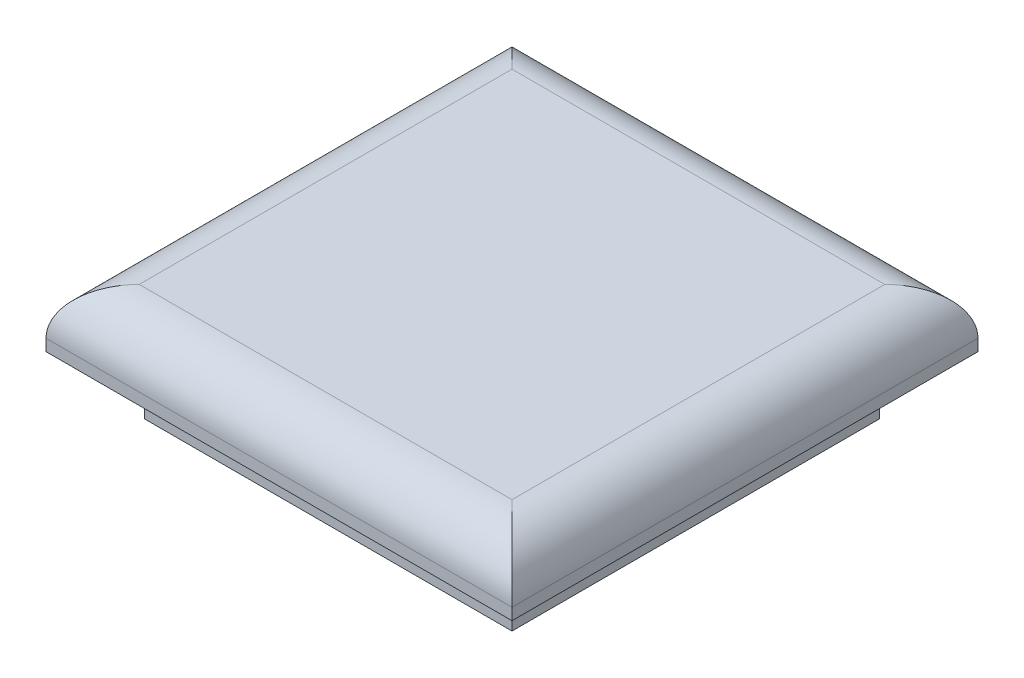
ISO-10303-21;
HEADER;
FILE_DESCRIPTION(('STEP AP214'),'2;1');
FILE_NAME('part.step','',(''),(''),'','','');
FILE_SCHEMA(('AUTOMOTIVE_DESIGN { 1 0 10303 214 1 1 1 1 }'));
ENDSEC;
DATA;
#1=APPLICATION_CONTEXT('core data for automotive mechanical design processes');
#2=APPLICATION_PROTOCOL_DEFINITION('international standard','automotive_design',2000,#1);
#3=PRODUCT_CONTEXT('',#1,'mechanical');
#4=PRODUCT('Part','Part','',(#3));
#5=PRODUCT_RELATED_PRODUCT_CATEGORY('part','',(#4));
#6=PRODUCT_DEFINITION_FORMATION('','',#4);
#7=PRODUCT_DEFINITION_CONTEXT('part definition',#1,'design');
#8=PRODUCT_DEFINITION('design','',#6,#7);
#9=PRODUCT_DEFINITION_SHAPE('','',#8);
#10=(LENGTH_UNIT() NAMED_UNIT(*) SI_UNIT(.MILLI.,.METRE.));
#11=(NAMED_UNIT(*) PLANE_ANGLE_UNIT() SI_UNIT($,.RADIAN.));
#12=(NAMED_UNIT(*) SI_UNIT($,.STERADIAN.) SOLID_ANGLE_UNIT());
#13=UNCERTAINTY_MEASURE_WITH_UNIT(LENGTH_MEASURE(1.E-05),#10,'distance_accuracy_value','');
#14=(GEOMETRIC_REPRESENTATION_CONTEXT(3) GLOBAL_UNCERTAINTY_ASSIGNED_CONTEXT((#13)) GLOBAL_UNIT_ASSIGNED_CONTEXT((#10,
#11,#12)) REPRESENTATION_CONTEXT('',''));
#15=CARTESIAN_POINT('',(0.,0.,0.));
#16=DIRECTION('',(0.,0.,1.));
#17=DIRECTION('',(1.,0.,0.));
#18=AXIS2_PLACEMENT_3D('',#15,#16,#17);
#19=CARTESIAN_POINT('',(0.,-3.175,-3.175));
#20=DIRECTION('',(0.,0.,1.));
#21=DIRECTION('',(1.,0.,0.));
#22=AXIS2_PLACEMENT_3D('',#19,#20,#21);
#23=PLANE('',#22);
#24=DIRECTION('',(1.,0.,0.));
#25=VECTOR('',#24,1.);
#26=CARTESIAN_POINT('',(0.,0.,-3.175));
#27=LINE('',#26,#25);
#28=CARTESIAN_POINT('',(3.175,0.,-3.175));
#29=VERTEX_POINT('',#28);
#30=CARTESIAN_POINT('',(16.853,0.,-3.175));
#31=VERTEX_POINT('',#30);
#32=EDGE_CURVE('E173',#29,#31,#27,.T.);
#33=ORIENTED_EDGE('',*,*,#32,.T.);
#34=DIRECTION('',(0.,1.,0.));
#35=VECTOR('',#34,1.);
#36=CARTESIAN_POINT('',(16.853,-3.175,-3.175));
#37=LINE('',#36,#35);
#38=CARTESIAN_POINT('',(16.853,-3.175,-3.175));
#39=VERTEX_POINT('',#38);
#40=EDGE_CURVE('E194',#39,#31,#37,.T.);
#41=ORIENTED_EDGE('',*,*,#40,.F.);
#42=DIRECTION('',(1.,0.,0.));
#43=VECTOR('',#42,1.);
#44=CARTESIAN_POINT('',(0.,-3.175,-3.175));
#45=LINE('',#44,#43);
#46=CARTESIAN_POINT('',(3.175,-3.175,-3.175));
#47=VERTEX_POINT('',#46);
#48=EDGE_CURVE('E272',#47,#39,#45,.T.);
#49=ORIENTED_EDGE('',*,*,#48,.F.);
#50=DIRECTION('',(0.,1.,0.));
#51=VECTOR('',#50,1.);
#52=CARTESIAN_POINT('',(3.175,-3.175,-3.175));
#53=LINE('',#52,#51);
#54=EDGE_CURVE('E202',#47,#29,#53,.T.);
#55=ORIENTED_EDGE('',*,*,#54,.T.);
#56=EDGE_LOOP('',(#33,#41,#49,#55));
#57=FACE_BOUND('',#56,.T.);
#58=ADVANCED_FACE('F33',(#57),#23,.F.);
#59=CARTESIAN_POINT('',(16.853,-3.175,0.));
#60=DIRECTION('',(1.,0.,0.));
#61=DIRECTION('',(0.,0.,-1.));
#62=AXIS2_PLACEMENT_3D('',#59,#60,#61);
#63=PLANE('',#62);
#64=DIRECTION('',(0.,0.,-1.));
#65=VECTOR('',#64,1.);
#66=CARTESIAN_POINT('',(16.853,0.,0.));
#67=LINE('',#66,#65);
#68=CARTESIAN_POINT('',(16.853,0.,-16.853));
#69=VERTEX_POINT('',#68);
#70=EDGE_CURVE('E190',#31,#69,#67,.T.);
#71=ORIENTED_EDGE('',*,*,#70,.T.);
#72=DIRECTION('',(0.,1.,0.));
#73=VECTOR('',#72,1.);
#74=CARTESIAN_POINT('',(16.853,-3.175,-16.853));
#75=LINE('',#74,#73);
#76=CARTESIAN_POINT('',(16.853,-3.175,-16.853));
#77=VERTEX_POINT('',#76);
#78=EDGE_CURVE('E197',#77,#69,#75,.T.);
#79=ORIENTED_EDGE('',*,*,#78,.F.);
#80=DIRECTION('',(0.,0.,-1.));
#81=VECTOR('',#80,1.);
#82=CARTESIAN_POINT('',(16.853,-3.175,0.));
#83=LINE('',#82,#81);
#84=EDGE_CURVE('E179',#39,#77,#83,.T.);
#85=ORIENTED_EDGE('',*,*,#84,.F.);
#86=ORIENTED_EDGE('',*,*,#40,.T.);
#87=EDGE_LOOP('',(#71,#79,#85,#86));
#88=FACE_BOUND('',#87,.T.);
#89=ADVANCED_FACE('F288',(#88),#63,.F.);
#90=CARTESIAN_POINT('',(0.,-3.175,-16.853));
#91=DIRECTION('',(0.,0.,1.));
#92=DIRECTION('',(1.,0.,0.));
#93=AXIS2_PLACEMENT_3D('',#90,#91,#92);
#94=PLANE('',#93);
#95=DIRECTION('',(1.,0.,0.));
#96=VECTOR('',#95,1.);
#97=CARTESIAN_POINT('',(0.,0.,-16.853));
#98=LINE('',#97,#96);
#99=CARTESIAN_POINT('',(3.175,0.,-16.853));
#100=VERTEX_POINT('',#99);
#101=EDGE_CURVE('E187',#100,#69,#98,.T.);
#102=ORIENTED_EDGE('',*,*,#101,.F.);
#103=DIRECTION('',(0.,1.,0.));
#104=VECTOR('',#103,1.);
#105=CARTESIAN_POINT('',(3.175,-3.175,-16.853));
#106=LINE('',#105,#104);
#107=CARTESIAN_POINT('',(3.175,-3.175,-16.853));
#108=VERTEX_POINT('',#107);
#109=EDGE_CURVE('E199',#108,#100,#106,.T.);
#110=ORIENTED_EDGE('',*,*,#109,.F.);
#111=DIRECTION('',(1.,0.,0.));
#112=VECTOR('',#111,1.);
#113=CARTESIAN_POINT('',(0.,-3.175,-16.853));
#114=LINE('',#113,#112);
#115=EDGE_CURVE('E277',#108,#77,#114,.T.);
#116=ORIENTED_EDGE('',*,*,#115,.T.);
#117=ORIENTED_EDGE('',*,*,#78,.T.);
#118=EDGE_LOOP('',(#102,#110,#116,#117));
#119=FACE_BOUND('',#118,.T.);
#120=ADVANCED_FACE('F290',(#119),#94,.T.);
#121=CARTESIAN_POINT('',(0.,-3.175,0.));
#122=DIRECTION('',(0.,0.,1.));
#123=DIRECTION('',(1.,0.,0.));
#124=AXIS2_PLACEMENT_3D('',#121,#122,#123);
#125=PLANE('',#124);
#126=DIRECTION('',(0.707106781186545,-0.70710678118655,0.));
#127=VECTOR('',#126,1.);
#128=CARTESIAN_POINT('',(20.028,-0.4,0.));
#129=LINE('',#128,#127);
#130=CARTESIAN_POINT('',(19.628,0.,0.));
#131=VERTEX_POINT('',#130);
#132=CARTESIAN_POINT('',(20.028,-0.4,0.));
#133=VERTEX_POINT('',#132);
#134=EDGE_CURVE('E149',#131,#133,#129,.T.);
#135=ORIENTED_EDGE('',*,*,#134,.F.);
#136=DIRECTION('',(1.,0.,0.));
#137=VECTOR('',#136,1.);
#138=CARTESIAN_POINT('',(0.,0.,0.));
#139=LINE('',#138,#137);
#140=CARTESIAN_POINT('',(0.4,0.,0.));
#141=VERTEX_POINT('',#140);
#142=EDGE_CURVE('E163',#141,#131,#139,.T.);
#143=ORIENTED_EDGE('',*,*,#142,.F.);
#144=DIRECTION('',(0.707106781186548,0.707106781186548,0.));
#145=VECTOR('',#144,1.);
#146=CARTESIAN_POINT('',(0.,-0.4,0.));
#147=LINE('',#146,#145);
#148=CARTESIAN_POINT('',(0.,-0.4,0.));
#149=VERTEX_POINT('',#148);
#150=EDGE_CURVE('E50',#149,#141,#147,.T.);
#151=ORIENTED_EDGE('',*,*,#150,.F.);
#152=DIRECTION('',(0.,1.,0.));
#153=VECTOR('',#152,1.);
#154=CARTESIAN_POINT('',(0.,-3.175,0.));
#155=LINE('',#154,#153);
#156=CARTESIAN_POINT('',(0.,-3.175,0.));
#157=VERTEX_POINT('',#156);
#158=EDGE_CURVE('E204',#157,#149,#155,.T.);
#159=ORIENTED_EDGE('',*,*,#158,.F.);
#160=DIRECTION('',(1.,0.,0.));
#161=VECTOR('',#160,1.);
#162=CARTESIAN_POINT('',(0.,-3.175,0.));
#163=LINE('',#162,#161);
#164=CARTESIAN_POINT('',(20.028,-3.175,0.));
#165=VERTEX_POINT('',#164);
#166=EDGE_CURVE('E193',#157,#165,#163,.T.);
#167=ORIENTED_EDGE('',*,*,#166,.T.);
#168=DIRECTION('',(0.,1.,0.));
#169=VECTOR('',#168,1.);
#170=CARTESIAN_POINT('',(20.028,-3.175,0.));
#171=LINE('',#170,#169);
#172=EDGE_CURVE('E165',#165,#133,#171,.T.);
#173=ORIENTED_EDGE('',*,*,#172,.T.);
#174=EDGE_LOOP('',(#135,#143,#151,#159,#167,#173));
#175=FACE_BOUND('',#174,.T.);
#176=ADVANCED_FACE('F162',(#175),#125,.T.);
#177=CARTESIAN_POINT('',(0.,-3.175,0.));
#178=DIRECTION('',(1.,0.,0.));
#179=DIRECTION('',(0.,0.,-1.));
#180=AXIS2_PLACEMENT_3D('',#177,#178,#179);
#181=PLANE('',#180);
#182=ORIENTED_EDGE('',*,*,#158,.T.);
#183=DIRECTION('',(0.,0.,1.));
#184=VECTOR('',#183,1.);
#185=CARTESIAN_POINT('',(0.,-0.4,-22.714));
#186=LINE('',#185,#184);
#187=CARTESIAN_POINT('',(0.,-0.4,-20.028));
#188=VERTEX_POINT('',#187);
#189=EDGE_CURVE('E487',#188,#149,#186,.T.);
#190=ORIENTED_EDGE('',*,*,#189,.F.);
#191=DIRECTION('',(0.,1.,0.));
#192=VECTOR('',#191,1.);
#193=CARTESIAN_POINT('',(0.,-3.175,-20.028));
#194=LINE('',#193,#192);
#195=CARTESIAN_POINT('',(0.,-3.175,-20.028));
#196=VERTEX_POINT('',#195);
#197=EDGE_CURVE('E207',#196,#188,#194,.T.);
#198=ORIENTED_EDGE('',*,*,#197,.F.);
#199=DIRECTION('',(0.,0.,-1.));
#200=VECTOR('',#199,1.);
#201=CARTESIAN_POINT('',(0.,-3.175,0.));
#202=LINE('',#201,#200);
#203=EDGE_CURVE('E270',#157,#196,#202,.T.);
#204=ORIENTED_EDGE('',*,*,#203,.F.);
#205=EDGE_LOOP('',(#182,#190,#198,#204));
#206=FACE_BOUND('',#205,.T.);
#207=ADVANCED_FACE('F307',(#206),#181,.F.);
#208=CARTESIAN_POINT('',(0.,-3.175,-20.028));
#209=DIRECTION('',(0.,0.,1.));
#210=DIRECTION('',(1.,0.,0.));
#211=AXIS2_PLACEMENT_3D('',#208,#209,#210);
#212=PLANE('',#211);
#213=DIRECTION('',(1.,0.,0.));
#214=VECTOR('',#213,1.);
#215=CARTESIAN_POINT('',(0.,0.,-20.028));
#216=LINE('',#215,#214);
#217=CARTESIAN_POINT('',(0.4,0.,-20.028));
#218=VERTEX_POINT('',#217);
#219=CARTESIAN_POINT('',(19.628,0.,-20.028));
#220=VERTEX_POINT('',#219);
#221=EDGE_CURVE('E170',#218,#220,#216,.T.);
#222=ORIENTED_EDGE('',*,*,#221,.T.);
#223=DIRECTION('',(0.707106781186545,-0.70710678118655,0.));
#224=VECTOR('',#223,1.);
#225=CARTESIAN_POINT('',(11.4015000000001,8.22649999999999,-20.028));
#226=LINE('',#225,#224);
#227=CARTESIAN_POINT('',(20.028,-0.4,-20.028));
#228=VERTEX_POINT('',#227);
#229=EDGE_CURVE('E152',#220,#228,#226,.T.);
#230=ORIENTED_EDGE('',*,*,#229,.T.);
#231=DIRECTION('',(0.,1.,0.));
#232=VECTOR('',#231,1.);
#233=CARTESIAN_POINT('',(20.028,-3.175,-20.028));
#234=LINE('',#233,#232);
#235=CARTESIAN_POINT('',(20.028,-3.175,-20.028));
#236=VERTEX_POINT('',#235);
#237=EDGE_CURVE('E210',#236,#228,#234,.T.);
#238=ORIENTED_EDGE('',*,*,#237,.F.);
#239=DIRECTION('',(1.,0.,0.));
#240=VECTOR('',#239,1.);
#241=CARTESIAN_POINT('',(0.,-3.175,-20.028));
#242=LINE('',#241,#240);
#243=EDGE_CURVE('E268',#196,#236,#242,.T.);
#244=ORIENTED_EDGE('',*,*,#243,.F.);
#245=ORIENTED_EDGE('',*,*,#197,.T.);
#246=DIRECTION('',(0.707106781186548,0.707106781186548,0.));
#247=VECTOR('',#246,1.);
#248=CARTESIAN_POINT('',(-1.3875,-1.7875,-20.028));
#249=LINE('',#248,#247);
#250=EDGE_CURVE('E231',#188,#218,#249,.T.);
#251=ORIENTED_EDGE('',*,*,#250,.T.);
#252=EDGE_LOOP('',(#222,#230,#238,#244,#245,#251));
#253=FACE_BOUND('',#252,.T.);
#254=ADVANCED_FACE('F310',(#253),#212,.F.);
#255=CARTESIAN_POINT('',(20.028,-3.175,0.));
#256=DIRECTION('',(1.,0.,0.));
#257=DIRECTION('',(0.,0.,-1.));
#258=AXIS2_PLACEMENT_3D('',#255,#256,#257);
#259=PLANE('',#258);
#260=DIRECTION('',(0.,0.,1.));
#261=VECTOR('',#260,1.);
#262=CARTESIAN_POINT('',(20.028,-0.4,-22.714));
#263=LINE('',#262,#261);
#264=EDGE_CURVE('E157',#228,#133,#263,.T.);
#265=ORIENTED_EDGE('',*,*,#264,.T.);
#266=ORIENTED_EDGE('',*,*,#172,.F.);
#267=DIRECTION('',(0.,0.,-1.));
#268=VECTOR('',#267,1.);
#269=CARTESIAN_POINT('',(20.028,-3.175,0.));
#270=LINE('',#269,#268);
#271=EDGE_CURVE('E265',#165,#236,#270,.T.);
#272=ORIENTED_EDGE('',*,*,#271,.T.);
#273=ORIENTED_EDGE('',*,*,#237,.T.);
#274=EDGE_LOOP('',(#265,#266,#272,#273));
#275=FACE_BOUND('',#274,.T.);
#276=ADVANCED_FACE('F314',(#275),#259,.T.);
#277=CARTESIAN_POINT('',(3.175,-3.175,0.));
#278=DIRECTION('',(1.,0.,0.));
#279=DIRECTION('',(0.,0.,-1.));
#280=AXIS2_PLACEMENT_3D('',#277,#278,#279);
#281=PLANE('',#280);
#282=DIRECTION('',(0.,0.,-1.));
#283=VECTOR('',#282,1.);
#284=CARTESIAN_POINT('',(3.175,0.,0.));
#285=LINE('',#284,#283);
#286=EDGE_CURVE('E184',#29,#100,#285,.T.);
#287=ORIENTED_EDGE('',*,*,#286,.F.);
#288=ORIENTED_EDGE('',*,*,#54,.F.);
#289=DIRECTION('',(0.,0.,-1.));
#290=VECTOR('',#289,1.);
#291=CARTESIAN_POINT('',(3.175,-3.175,0.));
#292=LINE('',#291,#290);
#293=EDGE_CURVE('E275',#47,#108,#292,.T.);
#294=ORIENTED_EDGE('',*,*,#293,.T.);
#295=ORIENTED_EDGE('',*,*,#109,.T.);
#296=EDGE_LOOP('',(#287,#288,#294,#295));
#297=FACE_BOUND('',#296,.T.);
#298=ADVANCED_FACE('F294',(#297),#281,.T.);
#299=CARTESIAN_POINT('',(0.,-3.175,0.));
#300=DIRECTION('',(0.,1.,0.));
#301=DIRECTION('',(0.,0.,1.));
#302=AXIS2_PLACEMENT_3D('',#299,#300,#301);
#303=PLANE('',#302);
#304=ORIENTED_EDGE('',*,*,#166,.F.);
#305=ORIENTED_EDGE('',*,*,#203,.T.);
#306=ORIENTED_EDGE('',*,*,#243,.T.);
#307=ORIENTED_EDGE('',*,*,#271,.F.);
#308=EDGE_LOOP('',(#304,#305,#306,#307));
#309=FACE_BOUND('',#308,.T.);
#310=ORIENTED_EDGE('',*,*,#48,.T.);
#311=ORIENTED_EDGE('',*,*,#84,.T.);
#312=ORIENTED_EDGE('',*,*,#115,.F.);
#313=ORIENTED_EDGE('',*,*,#293,.F.);
#314=EDGE_LOOP('',(#310,#311,#312,#313));
#315=FACE_BOUND('',#314,.T.);
#316=ADVANCED_FACE('F283',(#309,#315),#303,.F.);
#317=CARTESIAN_POINT('',(0.,0.,0.));
#318=DIRECTION('',(0.,1.,0.));
#319=DIRECTION('',(0.,0.,1.));
#320=AXIS2_PLACEMENT_3D('',#317,#318,#319);
#321=PLANE('',#320);
#322=ORIENTED_EDGE('',*,*,#70,.F.);
#323=ORIENTED_EDGE('',*,*,#32,.F.);
#324=ORIENTED_EDGE('',*,*,#286,.T.);
#325=ORIENTED_EDGE('',*,*,#101,.T.);
#326=EDGE_LOOP('',(#322,#323,#324,#325));
#327=FACE_BOUND('',#326,.T.);
#328=ADVANCED_FACE('F296',(#327),#321,.F.);
#329=CARTESIAN_POINT('',(22.714,3.175,0.));
#330=DIRECTION('',(1.,0.,0.));
#331=DIRECTION('',(0.,0.,-1.));
#332=AXIS2_PLACEMENT_3D('',#329,#330,#331);
#333=PLANE('',#332);
#334=DIRECTION('',(0.,-1.,0.));
#335=VECTOR('',#334,1.);
#336=CARTESIAN_POINT('',(22.714,3.175,-22.714));
#337=LINE('',#336,#335);
#338=CARTESIAN_POINT('',(22.714,0.635,-22.714));
#339=VERTEX_POINT('',#338);
#340=CARTESIAN_POINT('',(22.714,0.,-22.714));
#341=VERTEX_POINT('',#340);
#342=EDGE_CURVE('E171',#339,#341,#337,.T.);
#343=ORIENTED_EDGE('',*,*,#342,.F.);
#344=DIRECTION('',(0.,0.,1.));
#345=VECTOR('',#344,1.);
#346=CARTESIAN_POINT('',(22.714,0.635,0.));
#347=LINE('',#346,#345);
#348=CARTESIAN_POINT('',(22.714,0.635,2.686));
#349=VERTEX_POINT('',#348);
#350=EDGE_CURVE('E225',#339,#349,#347,.T.);
#351=ORIENTED_EDGE('',*,*,#350,.T.);
#352=DIRECTION('',(0.,-1.,0.));
#353=VECTOR('',#352,1.);
#354=CARTESIAN_POINT('',(22.714,3.175,2.686));
#355=LINE('',#354,#353);
#356=CARTESIAN_POINT('',(22.714,0.,2.686));
#357=VERTEX_POINT('',#356);
#358=EDGE_CURVE('E259',#349,#357,#355,.T.);
#359=ORIENTED_EDGE('',*,*,#358,.T.);
#360=DIRECTION('',(0.,0.,1.));
#361=VECTOR('',#360,1.);
#362=CARTESIAN_POINT('',(22.714,0.,0.));
#363=LINE('',#362,#361);
#364=EDGE_CURVE('E239',#341,#357,#363,.T.);
#365=ORIENTED_EDGE('',*,*,#364,.F.);
#366=EDGE_LOOP('',(#343,#351,#359,#365));
#367=FACE_BOUND('',#366,.T.);
#368=ADVANCED_FACE('F355',(#367),#333,.T.);
#369=CARTESIAN_POINT('',(0.,3.175,-22.714));
#370=DIRECTION('',(0.,0.,-1.));
#371=DIRECTION('',(-1.,0.,0.));
#372=AXIS2_PLACEMENT_3D('',#369,#370,#371);
#373=PLANE('',#372);
#374=DIRECTION('',(0.,-1.,0.));
#375=VECTOR('',#374,1.);
#376=CARTESIAN_POINT('',(-2.68599999999999,3.175,-22.714));
#377=LINE('',#376,#375);
#378=CARTESIAN_POINT('',(-2.68599999999999,0.635,-22.714));
#379=VERTEX_POINT('',#378);
#380=CARTESIAN_POINT('',(-2.68599999999999,0.,-22.714));
#381=VERTEX_POINT('',#380);
#382=EDGE_CURVE('E176',#379,#381,#377,.T.);
#383=ORIENTED_EDGE('',*,*,#382,.F.);
#384=DIRECTION('',(1.,0.,0.));
#385=VECTOR('',#384,1.);
#386=CARTESIAN_POINT('',(0.,0.635,-22.714));
#387=LINE('',#386,#385);
#388=EDGE_CURVE('E196',#379,#339,#387,.T.);
#389=ORIENTED_EDGE('',*,*,#388,.T.);
#390=ORIENTED_EDGE('',*,*,#342,.T.);
#391=DIRECTION('',(1.,0.,0.));
#392=VECTOR('',#391,1.);
#393=CARTESIAN_POINT('',(0.,0.,-22.714));
#394=LINE('',#393,#392);
#395=EDGE_CURVE('E245',#381,#341,#394,.T.);
#396=ORIENTED_EDGE('',*,*,#395,.F.);
#397=EDGE_LOOP('',(#383,#389,#390,#396));
#398=FACE_BOUND('',#397,.T.);
#399=ADVANCED_FACE('F351',(#398),#373,.T.);
#400=CARTESIAN_POINT('',(-2.68599999999999,3.175,0.));
#401=DIRECTION('',(1.,0.,0.));
#402=DIRECTION('',(0.,0.,-1.));
#403=AXIS2_PLACEMENT_3D('',#400,#401,#402);
#404=PLANE('',#403);
#405=DIRECTION('',(0.,-1.,0.));
#406=VECTOR('',#405,1.);
#407=CARTESIAN_POINT('',(-2.68599999999999,3.175,2.686));
#408=LINE('',#407,#406);
#409=CARTESIAN_POINT('',(-2.68599999999999,0.635,2.686));
#410=VERTEX_POINT('',#409);
#411=CARTESIAN_POINT('',(-2.68599999999999,0.,2.686));
#412=VERTEX_POINT('',#411);
#413=EDGE_CURVE('E261',#410,#412,#408,.T.);
#414=ORIENTED_EDGE('',*,*,#413,.F.);
#415=DIRECTION('',(0.,0.,1.));
#416=VECTOR('',#415,1.);
#417=CARTESIAN_POINT('',(-2.68599999999999,0.635,-22.714));
#418=LINE('',#417,#416);
#419=EDGE_CURVE('E11',#410,#379,#418,.F.);
#420=ORIENTED_EDGE('',*,*,#419,.T.);
#421=ORIENTED_EDGE('',*,*,#382,.T.);
#422=DIRECTION('',(0.,0.,1.));
#423=VECTOR('',#422,1.);
#424=CARTESIAN_POINT('',(-2.68599999999999,0.,0.));
#425=LINE('',#424,#423);
#426=EDGE_CURVE('E249',#381,#412,#425,.T.);
#427=ORIENTED_EDGE('',*,*,#426,.T.);
#428=EDGE_LOOP('',(#414,#420,#421,#427));
#429=FACE_BOUND('',#428,.T.);
#430=ADVANCED_FACE('F347',(#429),#404,.F.);
#431=CARTESIAN_POINT('',(0.,3.175,2.686));
#432=DIRECTION('',(0.,0.,-1.));
#433=DIRECTION('',(-1.,0.,0.));
#434=AXIS2_PLACEMENT_3D('',#431,#432,#433);
#435=PLANE('',#434);
#436=ORIENTED_EDGE('',*,*,#358,.F.);
#437=DIRECTION('',(1.,0.,0.));
#438=VECTOR('',#437,1.);
#439=CARTESIAN_POINT('',(-2.68599999999999,0.635,2.686));
#440=LINE('',#439,#438);
#441=EDGE_CURVE('E42',#349,#410,#440,.F.);
#442=ORIENTED_EDGE('',*,*,#441,.T.);
#443=ORIENTED_EDGE('',*,*,#413,.T.);
#444=DIRECTION('',(1.,0.,0.));
#445=VECTOR('',#444,1.);
#446=CARTESIAN_POINT('',(0.,0.,2.686));
#447=LINE('',#446,#445);
#448=EDGE_CURVE('E256',#412,#357,#447,.T.);
#449=ORIENTED_EDGE('',*,*,#448,.T.);
#450=EDGE_LOOP('',(#436,#442,#443,#449));
#451=FACE_BOUND('',#450,.T.);
#452=ADVANCED_FACE('F353',(#451),#435,.F.);
#453=CARTESIAN_POINT('',(0.,3.175,0.));
#454=DIRECTION('',(0.,1.,0.));
#455=DIRECTION('',(0.,0.,1.));
#456=AXIS2_PLACEMENT_3D('',#453,#454,#455);
#457=PLANE('',#456);
#458=DIRECTION('',(0.,0.,1.));
#459=VECTOR('',#458,1.);
#460=CARTESIAN_POINT('',(20.174,3.175,0.));
#461=LINE('',#460,#459);
#462=CARTESIAN_POINT('',(20.174,3.175,0.145999999999996));
#463=VERTEX_POINT('',#462);
#464=CARTESIAN_POINT('',(20.174,3.175,-20.174));
#465=VERTEX_POINT('',#464);
#466=EDGE_CURVE('E220',#463,#465,#461,.F.);
#467=ORIENTED_EDGE('',*,*,#466,.T.);
#468=DIRECTION('',(1.,0.,0.));
#469=VECTOR('',#468,1.);
#470=CARTESIAN_POINT('',(0.,3.175,-20.174));
#471=LINE('',#470,#469);
#472=CARTESIAN_POINT('',(-0.14599999999999,3.175,-20.174));
#473=VERTEX_POINT('',#472);
#474=EDGE_CURVE('E222',#465,#473,#471,.F.);
#475=ORIENTED_EDGE('',*,*,#474,.T.);
#476=DIRECTION('',(0.,0.,1.));
#477=VECTOR('',#476,1.);
#478=CARTESIAN_POINT('',(-0.145999999999989,3.175,2.686));
#479=LINE('',#478,#477);
#480=CARTESIAN_POINT('',(-0.145999999999989,3.175,0.145999999999999));
#481=VERTEX_POINT('',#480);
#482=EDGE_CURVE('E216',#473,#481,#479,.T.);
#483=ORIENTED_EDGE('',*,*,#482,.T.);
#484=DIRECTION('',(1.,0.,0.));
#485=VECTOR('',#484,1.);
#486=CARTESIAN_POINT('',(22.714,3.175,0.145999999999995));
#487=LINE('',#486,#485);
#488=EDGE_CURVE('E218',#481,#463,#487,.T.);
#489=ORIENTED_EDGE('',*,*,#488,.T.);
#490=EDGE_LOOP('',(#467,#475,#483,#489));
#491=FACE_BOUND('',#490,.T.);
#492=ADVANCED_FACE('F337',(#491),#457,.T.);
#493=DIRECTION('',(0.,0.,1.));
#494=VECTOR('',#493,1.);
#495=CARTESIAN_POINT('',(19.628,0.,-22.714));
#496=LINE('',#495,#494);
#497=EDGE_CURVE('E146',#220,#131,#496,.T.);
#498=ORIENTED_EDGE('',*,*,#497,.F.);
#499=ORIENTED_EDGE('',*,*,#221,.F.);
#500=DIRECTION('',(0.,0.,1.));
#501=VECTOR('',#500,1.);
#502=CARTESIAN_POINT('',(0.4,0.,-22.714));
#503=LINE('',#502,#501);
#504=EDGE_CURVE('E169',#218,#141,#503,.T.);
#505=ORIENTED_EDGE('',*,*,#504,.T.);
#506=ORIENTED_EDGE('',*,*,#142,.T.);
#507=EDGE_LOOP('',(#498,#499,#505,#506));
#508=FACE_BOUND('',#507,.T.);
#509=ORIENTED_EDGE('',*,*,#395,.T.);
#510=ORIENTED_EDGE('',*,*,#364,.T.);
#511=ORIENTED_EDGE('',*,*,#448,.F.);
#512=ORIENTED_EDGE('',*,*,#426,.F.);
#513=EDGE_LOOP('',(#509,#510,#511,#512));
#514=FACE_BOUND('',#513,.T.);
#515=ADVANCED_FACE('F167',(#508,#514),#321,.F.);
#516=CARTESIAN_POINT('',(0.,0.635,0.145999999999999));
#517=DIRECTION('',(-1.,0.,0.));
#518=DIRECTION('',(0.,0.,1.));
#519=AXIS2_PLACEMENT_3D('',#516,#517,#518);
#520=CYLINDRICAL_SURFACE('',#519,2.54);
#521=CARTESIAN_POINT('',(20.174,0.635,0.145999999999996));
#522=DIRECTION('',(-0.707106781186547,0.,0.707106781186548));
#523=DIRECTION('',(-0.707106781186548,0.,-0.707106781186547));
#524=AXIS2_PLACEMENT_3D('',#521,#522,#523);
#525=ELLIPSE('',#524,3.59210244842766,2.54);
#526=EDGE_CURVE('E232',#463,#349,#525,.F.);
#527=ORIENTED_EDGE('',*,*,#526,.F.);
#528=ORIENTED_EDGE('',*,*,#488,.F.);
#529=CARTESIAN_POINT('',(-0.145999999999989,0.635,0.145999999999999));
#530=DIRECTION('',(-0.707106781186548,0.,-0.707106781186547));
#531=DIRECTION('',(0.707106781186547,0.,-0.707106781186548));
#532=AXIS2_PLACEMENT_3D('',#529,#530,#531);
#533=ELLIPSE('',#532,3.59210244842766,2.54);
#534=EDGE_CURVE('E37',#410,#481,#533,.T.);
#535=ORIENTED_EDGE('',*,*,#534,.F.);
#536=ORIENTED_EDGE('',*,*,#441,.F.);
#537=EDGE_LOOP('',(#527,#528,#535,#536));
#538=FACE_BOUND('',#537,.T.);
#539=ADVANCED_FACE('F35',(#538),#520,.T.);
#540=CARTESIAN_POINT('',(-0.145999999999989,0.635,0.));
#541=DIRECTION('',(0.,0.,-1.));
#542=DIRECTION('',(-1.,0.,0.));
#543=AXIS2_PLACEMENT_3D('',#540,#541,#542);
#544=CYLINDRICAL_SURFACE('',#543,2.54);
#545=ORIENTED_EDGE('',*,*,#534,.T.);
#546=ORIENTED_EDGE('',*,*,#482,.F.);
#547=CARTESIAN_POINT('',(-0.14599999999999,0.635,-20.174));
#548=DIRECTION('',(0.707106781186547,0.,-0.707106781186548));
#549=DIRECTION('',(-0.707106781186548,0.,-0.707106781186547));
#550=AXIS2_PLACEMENT_3D('',#547,#548,#549);
#551=ELLIPSE('',#550,3.59210244842766,2.54);
#552=EDGE_CURVE('E230',#379,#473,#551,.T.);
#553=ORIENTED_EDGE('',*,*,#552,.F.);
#554=ORIENTED_EDGE('',*,*,#419,.F.);
#555=EDGE_LOOP('',(#545,#546,#553,#554));
#556=FACE_BOUND('',#555,.T.);
#557=ADVANCED_FACE('F328',(#556),#544,.T.);
#558=CARTESIAN_POINT('',(20.174,0.635,0.));
#559=DIRECTION('',(0.,0.,1.));
#560=DIRECTION('',(1.,0.,0.));
#561=AXIS2_PLACEMENT_3D('',#558,#559,#560);
#562=CYLINDRICAL_SURFACE('',#561,2.54);
#563=ORIENTED_EDGE('',*,*,#526,.T.);
#564=ORIENTED_EDGE('',*,*,#350,.F.);
#565=CARTESIAN_POINT('',(20.174,0.635,-20.174));
#566=DIRECTION('',(0.707106781186548,0.,0.707106781186547));
#567=DIRECTION('',(-0.707106781186547,0.,0.707106781186548));
#568=AXIS2_PLACEMENT_3D('',#565,#566,#567);
#569=ELLIPSE('',#568,3.59210244842766,2.54);
#570=EDGE_CURVE('E228',#465,#339,#569,.F.);
#571=ORIENTED_EDGE('',*,*,#570,.F.);
#572=ORIENTED_EDGE('',*,*,#466,.F.);
#573=EDGE_LOOP('',(#563,#564,#571,#572));
#574=FACE_BOUND('',#573,.T.);
#575=ADVANCED_FACE('F325',(#574),#562,.T.);
#576=CARTESIAN_POINT('',(0.,0.635,-20.174));
#577=DIRECTION('',(1.,0.,0.));
#578=DIRECTION('',(0.,0.,-1.));
#579=AXIS2_PLACEMENT_3D('',#576,#577,#578);
#580=CYLINDRICAL_SURFACE('',#579,2.54);
#581=ORIENTED_EDGE('',*,*,#552,.T.);
#582=ORIENTED_EDGE('',*,*,#474,.F.);
#583=ORIENTED_EDGE('',*,*,#570,.T.);
#584=ORIENTED_EDGE('',*,*,#388,.F.);
#585=EDGE_LOOP('',(#581,#582,#583,#584));
#586=FACE_BOUND('',#585,.T.);
#587=ADVANCED_FACE('F321',(#586),#580,.T.);
#588=CARTESIAN_POINT('',(0.,-0.4,-22.714));
#589=DIRECTION('',(0.707106781186548,-0.707106781186548,0.));
#590=DIRECTION('',(0.707106781186548,0.707106781186548,0.));
#591=AXIS2_PLACEMENT_3D('',#588,#589,#590);
#592=PLANE('',#591);
#593=ORIENTED_EDGE('',*,*,#189,.T.);
#594=ORIENTED_EDGE('',*,*,#150,.T.);
#595=ORIENTED_EDGE('',*,*,#504,.F.);
#596=ORIENTED_EDGE('',*,*,#250,.F.);
#597=EDGE_LOOP('',(#593,#594,#595,#596));
#598=FACE_BOUND('',#597,.T.);
#599=ADVANCED_FACE('F324',(#598),#592,.F.);
#600=CARTESIAN_POINT('',(20.028,-0.4,-22.714));
#601=DIRECTION('',(-0.70710678118655,-0.707106781186545,0.));
#602=DIRECTION('',(0.707106781186545,-0.70710678118655,0.));
#603=AXIS2_PLACEMENT_3D('',#600,#601,#602);
#604=PLANE('',#603);
#605=ORIENTED_EDGE('',*,*,#497,.T.);
#606=ORIENTED_EDGE('',*,*,#134,.T.);
#607=ORIENTED_EDGE('',*,*,#264,.F.);
#608=ORIENTED_EDGE('',*,*,#229,.F.);
#609=EDGE_LOOP('',(#605,#606,#607,#608));
#610=FACE_BOUND('',#609,.T.);
#611=ADVANCED_FACE('F148',(#610),#604,.F.);
#612=CLOSED_SHELL('',(#58,#89,#120,#176,#207,#254,#276,#298,#316,#328,#368,#399,#430,#452,#492,
#515,#539,#557,#575,#587,#599,#611));
#613=MANIFOLD_SOLID_BREP('B2',#612);
#614=ADVANCED_BREP_SHAPE_REPRESENTATION('',(#18,#613),#14);
#615=SHAPE_DEFINITION_REPRESENTATION(#9,#614);
ENDSEC;
END-ISO-10303-21;
